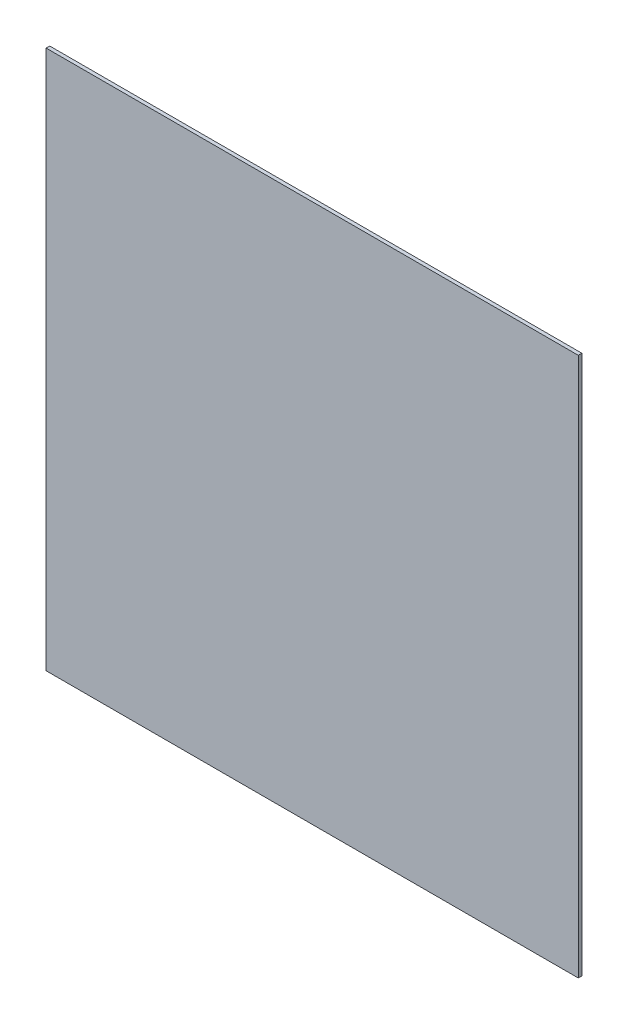
ISO-10303-21;
HEADER;
FILE_DESCRIPTION(('STEP AP214'),'2;1');
FILE_NAME('part.step','',(''),(''),'','','');
FILE_SCHEMA(('AUTOMOTIVE_DESIGN { 1 0 10303 214 1 1 1 1 }'));
ENDSEC;
DATA;
#1=APPLICATION_CONTEXT('core data for automotive mechanical design processes');
#2=APPLICATION_PROTOCOL_DEFINITION('international standard','automotive_design',2000,#1);
#3=PRODUCT_CONTEXT('',#1,'mechanical');
#4=PRODUCT('Part','Part','',(#3));
#5=PRODUCT_RELATED_PRODUCT_CATEGORY('part','',(#4));
#6=PRODUCT_DEFINITION_FORMATION('','',#4);
#7=PRODUCT_DEFINITION_CONTEXT('part definition',#1,'design');
#8=PRODUCT_DEFINITION('design','',#6,#7);
#9=PRODUCT_DEFINITION_SHAPE('','',#8);
#10=(LENGTH_UNIT() NAMED_UNIT(*) SI_UNIT(.MILLI.,.METRE.));
#11=(NAMED_UNIT(*) PLANE_ANGLE_UNIT() SI_UNIT($,.RADIAN.));
#12=(NAMED_UNIT(*) SI_UNIT($,.STERADIAN.) SOLID_ANGLE_UNIT());
#13=UNCERTAINTY_MEASURE_WITH_UNIT(LENGTH_MEASURE(1.E-05),#10,'distance_accuracy_value','');
#14=(GEOMETRIC_REPRESENTATION_CONTEXT(3) GLOBAL_UNCERTAINTY_ASSIGNED_CONTEXT((#13)) GLOBAL_UNIT_ASSIGNED_CONTEXT((#10,
#11,#12)) REPRESENTATION_CONTEXT('',''));
#15=CARTESIAN_POINT('',(0.,0.,0.));
#16=DIRECTION('',(0.,0.,1.));
#17=DIRECTION('',(1.,0.,0.));
#18=AXIS2_PLACEMENT_3D('',#15,#16,#17);
#19=CARTESIAN_POINT('',(0.,0.,3.));
#20=DIRECTION('',(1.,0.,0.));
#21=DIRECTION('',(0.,0.,-1.));
#22=AXIS2_PLACEMENT_3D('',#19,#20,#21);
#23=PLANE('',#22);
#24=DIRECTION('',(0.,-1.,0.));
#25=VECTOR('',#24,1.);
#26=CARTESIAN_POINT('',(0.,0.,0.));
#27=LINE('',#26,#25);
#28=CARTESIAN_POINT('',(0.,450.,0.));
#29=VERTEX_POINT('',#28);
#30=CARTESIAN_POINT('',(0.,0.,0.));
#31=VERTEX_POINT('',#30);
#32=EDGE_CURVE('E111',#29,#31,#27,.T.);
#33=ORIENTED_EDGE('',*,*,#32,.T.);
#34=DIRECTION('',(0.,0.,-1.));
#35=VECTOR('',#34,1.);
#36=CARTESIAN_POINT('',(0.,0.,3.));
#37=LINE('',#36,#35);
#38=CARTESIAN_POINT('',(0.,0.,3.));
#39=VERTEX_POINT('',#38);
#40=EDGE_CURVE('E11',#39,#31,#37,.T.);
#41=ORIENTED_EDGE('',*,*,#40,.F.);
#42=DIRECTION('',(0.,-1.,0.));
#43=VECTOR('',#42,1.);
#44=CARTESIAN_POINT('',(0.,0.,3.));
#45=LINE('',#44,#43);
#46=CARTESIAN_POINT('',(0.,450.,3.));
#47=VERTEX_POINT('',#46);
#48=EDGE_CURVE('E95',#47,#39,#45,.T.);
#49=ORIENTED_EDGE('',*,*,#48,.F.);
#50=DIRECTION('',(0.,0.,-1.));
#51=VECTOR('',#50,1.);
#52=CARTESIAN_POINT('',(0.,450.,3.));
#53=LINE('',#52,#51);
#54=EDGE_CURVE('E107',#47,#29,#53,.T.);
#55=ORIENTED_EDGE('',*,*,#54,.T.);
#56=EDGE_LOOP('',(#33,#41,#49,#55));
#57=FACE_BOUND('',#56,.T.);
#58=ADVANCED_FACE('F43',(#57),#23,.F.);
#59=CARTESIAN_POINT('',(0.,0.,3.));
#60=DIRECTION('',(0.,1.,0.));
#61=DIRECTION('',(0.,0.,1.));
#62=AXIS2_PLACEMENT_3D('',#59,#60,#61);
#63=PLANE('',#62);
#64=DIRECTION('',(1.,0.,0.));
#65=VECTOR('',#64,1.);
#66=CARTESIAN_POINT('',(0.,0.,0.));
#67=LINE('',#66,#65);
#68=CARTESIAN_POINT('',(444.,0.,0.));
#69=VERTEX_POINT('',#68);
#70=EDGE_CURVE('E100',#31,#69,#67,.T.);
#71=ORIENTED_EDGE('',*,*,#70,.T.);
#72=DIRECTION('',(0.,0.,-1.));
#73=VECTOR('',#72,1.);
#74=CARTESIAN_POINT('',(444.,0.,3.));
#75=LINE('',#74,#73);
#76=CARTESIAN_POINT('',(444.,0.,3.));
#77=VERTEX_POINT('',#76);
#78=EDGE_CURVE('E52',#77,#69,#75,.T.);
#79=ORIENTED_EDGE('',*,*,#78,.F.);
#80=DIRECTION('',(1.,0.,0.));
#81=VECTOR('',#80,1.);
#82=CARTESIAN_POINT('',(0.,0.,3.));
#83=LINE('',#82,#81);
#84=EDGE_CURVE('E90',#39,#77,#83,.T.);
#85=ORIENTED_EDGE('',*,*,#84,.F.);
#86=ORIENTED_EDGE('',*,*,#40,.T.);
#87=EDGE_LOOP('',(#71,#79,#85,#86));
#88=FACE_BOUND('',#87,.T.);
#89=ADVANCED_FACE('F99',(#88),#63,.F.);
#90=CARTESIAN_POINT('',(444.,0.,3.));
#91=DIRECTION('',(-1.,0.,0.));
#92=DIRECTION('',(0.,0.,1.));
#93=AXIS2_PLACEMENT_3D('',#90,#91,#92);
#94=PLANE('',#93);
#95=DIRECTION('',(0.,1.,0.));
#96=VECTOR('',#95,1.);
#97=CARTESIAN_POINT('',(444.,0.,0.));
#98=LINE('',#97,#96);
#99=CARTESIAN_POINT('',(444.,450.,0.));
#100=VERTEX_POINT('',#99);
#101=EDGE_CURVE('E77',#69,#100,#98,.T.);
#102=ORIENTED_EDGE('',*,*,#101,.T.);
#103=DIRECTION('',(0.,0.,-1.));
#104=VECTOR('',#103,1.);
#105=CARTESIAN_POINT('',(444.,450.,3.));
#106=LINE('',#105,#104);
#107=CARTESIAN_POINT('',(444.,450.,3.));
#108=VERTEX_POINT('',#107);
#109=EDGE_CURVE('E102',#108,#100,#106,.T.);
#110=ORIENTED_EDGE('',*,*,#109,.F.);
#111=DIRECTION('',(0.,1.,0.));
#112=VECTOR('',#111,1.);
#113=CARTESIAN_POINT('',(444.,0.,3.));
#114=LINE('',#113,#112);
#115=EDGE_CURVE('E93',#77,#108,#114,.T.);
#116=ORIENTED_EDGE('',*,*,#115,.F.);
#117=ORIENTED_EDGE('',*,*,#78,.T.);
#118=EDGE_LOOP('',(#102,#110,#116,#117));
#119=FACE_BOUND('',#118,.T.);
#120=ADVANCED_FACE('F103',(#119),#94,.F.);
#121=CARTESIAN_POINT('',(0.,450.,3.));
#122=DIRECTION('',(0.,-1.,0.));
#123=DIRECTION('',(0.,0.,-1.));
#124=AXIS2_PLACEMENT_3D('',#121,#122,#123);
#125=PLANE('',#124);
#126=DIRECTION('',(-1.,0.,0.));
#127=VECTOR('',#126,1.);
#128=CARTESIAN_POINT('',(0.,450.,0.));
#129=LINE('',#128,#127);
#130=EDGE_CURVE('E83',#100,#29,#129,.T.);
#131=ORIENTED_EDGE('',*,*,#130,.T.);
#132=ORIENTED_EDGE('',*,*,#54,.F.);
#133=DIRECTION('',(-1.,0.,0.));
#134=VECTOR('',#133,1.);
#135=CARTESIAN_POINT('',(0.,450.,3.));
#136=LINE('',#135,#134);
#137=EDGE_CURVE('E60',#108,#47,#136,.T.);
#138=ORIENTED_EDGE('',*,*,#137,.F.);
#139=ORIENTED_EDGE('',*,*,#109,.T.);
#140=EDGE_LOOP('',(#131,#132,#138,#139));
#141=FACE_BOUND('',#140,.T.);
#142=ADVANCED_FACE('F124',(#141),#125,.F.);
#143=CARTESIAN_POINT('',(0.,0.,3.));
#144=DIRECTION('',(0.,0.,-1.));
#145=DIRECTION('',(-1.,0.,0.));
#146=AXIS2_PLACEMENT_3D('',#143,#144,#145);
#147=PLANE('',#146);
#148=ORIENTED_EDGE('',*,*,#48,.T.);
#149=ORIENTED_EDGE('',*,*,#84,.T.);
#150=ORIENTED_EDGE('',*,*,#115,.T.);
#151=ORIENTED_EDGE('',*,*,#137,.T.);
#152=EDGE_LOOP('',(#148,#149,#150,#151));
#153=FACE_BOUND('',#152,.T.);
#154=ADVANCED_FACE('F91',(#153),#147,.F.);
#155=CARTESIAN_POINT('',(0.,0.,0.));
#156=DIRECTION('',(0.,0.,-1.));
#157=DIRECTION('',(-1.,0.,0.));
#158=AXIS2_PLACEMENT_3D('',#155,#156,#157);
#159=PLANE('',#158);
#160=ORIENTED_EDGE('',*,*,#32,.F.);
#161=ORIENTED_EDGE('',*,*,#130,.F.);
#162=ORIENTED_EDGE('',*,*,#101,.F.);
#163=ORIENTED_EDGE('',*,*,#70,.F.);
#164=EDGE_LOOP('',(#160,#161,#162,#163));
#165=FACE_BOUND('',#164,.T.);
#166=ADVANCED_FACE('F127',(#165),#159,.T.);
#167=CLOSED_SHELL('',(#58,#89,#120,#142,#154,#166));
#168=MANIFOLD_SOLID_BREP('B2',#167);
#169=ADVANCED_BREP_SHAPE_REPRESENTATION('',(#18,#168),#14);
#170=SHAPE_DEFINITION_REPRESENTATION(#9,#169);
ENDSEC;
END-ISO-10303-21;
